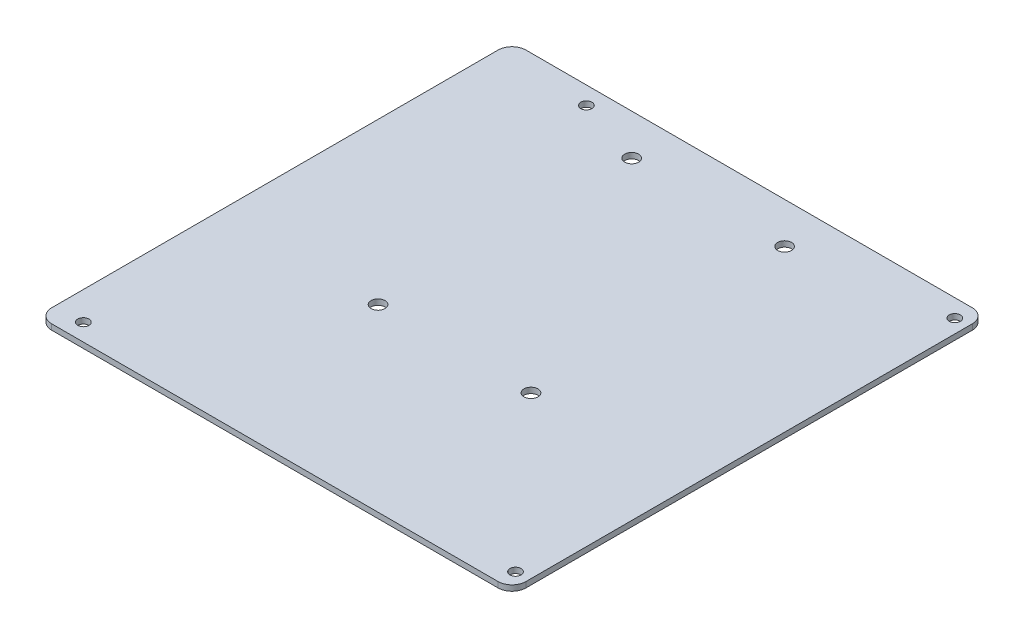
ISO-10303-21;
HEADER;
FILE_DESCRIPTION(('STEP AP214'),'2;1');
FILE_NAME('part.step','',(''),(''),'','','');
FILE_SCHEMA(('AUTOMOTIVE_DESIGN { 1 0 10303 214 1 1 1 1 }'));
ENDSEC;
DATA;
#1=APPLICATION_CONTEXT('core data for automotive mechanical design processes');
#2=APPLICATION_PROTOCOL_DEFINITION('international standard','automotive_design',2000,#1);
#3=PRODUCT_CONTEXT('',#1,'mechanical');
#4=PRODUCT('Part','Part','',(#3));
#5=PRODUCT_RELATED_PRODUCT_CATEGORY('part','',(#4));
#6=PRODUCT_DEFINITION_FORMATION('','',#4);
#7=PRODUCT_DEFINITION_CONTEXT('part definition',#1,'design');
#8=PRODUCT_DEFINITION('design','',#6,#7);
#9=PRODUCT_DEFINITION_SHAPE('','',#8);
#10=(LENGTH_UNIT() NAMED_UNIT(*) SI_UNIT(.MILLI.,.METRE.));
#11=(NAMED_UNIT(*) PLANE_ANGLE_UNIT() SI_UNIT($,.RADIAN.));
#12=(NAMED_UNIT(*) SI_UNIT($,.STERADIAN.) SOLID_ANGLE_UNIT());
#13=UNCERTAINTY_MEASURE_WITH_UNIT(LENGTH_MEASURE(1.E-05),#10,'distance_accuracy_value','');
#14=(GEOMETRIC_REPRESENTATION_CONTEXT(3) GLOBAL_UNCERTAINTY_ASSIGNED_CONTEXT((#13)) GLOBAL_UNIT_ASSIGNED_CONTEXT((#10,
#11,#12)) REPRESENTATION_CONTEXT('',''));
#15=CARTESIAN_POINT('',(0.,0.,0.));
#16=DIRECTION('',(0.,0.,1.));
#17=DIRECTION('',(1.,0.,0.));
#18=AXIS2_PLACEMENT_3D('',#15,#16,#17);
#19=CARTESIAN_POINT('',(80.0000000000019,2.,80.));
#20=DIRECTION('',(0.,-1.,0.));
#21=DIRECTION('',(0.,0.,-1.));
#22=AXIS2_PLACEMENT_3D('',#19,#20,#21);
#23=CYLINDRICAL_SURFACE('',#22,5.);
#24=CARTESIAN_POINT('',(80.0000000000019,0.,80.));
#25=DIRECTION('',(0.,-1.,0.));
#26=DIRECTION('',(0.,0.,-1.));
#27=AXIS2_PLACEMENT_3D('',#24,#25,#26);
#28=CIRCLE('',#27,5.);
#29=CARTESIAN_POINT('',(85.0000000000019,0.,80.));
#30=VERTEX_POINT('',#29);
#31=CARTESIAN_POINT('',(80.0000000000019,0.,85.));
#32=VERTEX_POINT('',#31);
#33=EDGE_CURVE('E134',#30,#32,#28,.T.);
#34=ORIENTED_EDGE('',*,*,#33,.F.);
#35=DIRECTION('',(0.,-1.,0.));
#36=VECTOR('',#35,1.);
#37=CARTESIAN_POINT('',(85.0000000000019,2.,80.));
#38=LINE('',#37,#36);
#39=CARTESIAN_POINT('',(85.0000000000019,2.,80.));
#40=VERTEX_POINT('',#39);
#41=EDGE_CURVE('E11',#40,#30,#38,.T.);
#42=ORIENTED_EDGE('',*,*,#41,.F.);
#43=CARTESIAN_POINT('',(80.0000000000019,2.,80.));
#44=DIRECTION('',(0.,-1.,0.));
#45=DIRECTION('',(0.,0.,-1.));
#46=AXIS2_PLACEMENT_3D('',#43,#44,#45);
#47=CIRCLE('',#46,5.);
#48=CARTESIAN_POINT('',(80.0000000000019,2.,85.));
#49=VERTEX_POINT('',#48);
#50=EDGE_CURVE('E155',#40,#49,#47,.T.);
#51=ORIENTED_EDGE('',*,*,#50,.T.);
#52=DIRECTION('',(0.,-1.,0.));
#53=VECTOR('',#52,1.);
#54=CARTESIAN_POINT('',(80.0000000000019,2.,85.));
#55=LINE('',#54,#53);
#56=EDGE_CURVE('E92',#49,#32,#55,.T.);
#57=ORIENTED_EDGE('',*,*,#56,.T.);
#58=EDGE_LOOP('',(#34,#42,#51,#57));
#59=FACE_BOUND('',#58,.T.);
#60=ADVANCED_FACE('F36',(#59),#23,.T.);
#61=CARTESIAN_POINT('',(85.0000000000019,2.,-80.));
#62=DIRECTION('',(1.,0.,0.));
#63=DIRECTION('',(0.,0.,-1.));
#64=AXIS2_PLACEMENT_3D('',#61,#62,#63);
#65=PLANE('',#64);
#66=DIRECTION('',(0.,0.,1.));
#67=VECTOR('',#66,1.);
#68=CARTESIAN_POINT('',(85.0000000000019,0.,-80.));
#69=LINE('',#68,#67);
#70=CARTESIAN_POINT('',(85.0000000000019,0.,-80.));
#71=VERTEX_POINT('',#70);
#72=EDGE_CURVE('E153',#71,#30,#69,.T.);
#73=ORIENTED_EDGE('',*,*,#72,.F.);
#74=DIRECTION('',(0.,-1.,0.));
#75=VECTOR('',#74,1.);
#76=CARTESIAN_POINT('',(85.0000000000019,2.,-80.));
#77=LINE('',#76,#75);
#78=CARTESIAN_POINT('',(85.0000000000019,2.,-80.));
#79=VERTEX_POINT('',#78);
#80=EDGE_CURVE('E45',#79,#71,#77,.T.);
#81=ORIENTED_EDGE('',*,*,#80,.F.);
#82=DIRECTION('',(0.,0.,1.));
#83=VECTOR('',#82,1.);
#84=CARTESIAN_POINT('',(85.0000000000019,2.,-80.));
#85=LINE('',#84,#83);
#86=EDGE_CURVE('E124',#79,#40,#85,.T.);
#87=ORIENTED_EDGE('',*,*,#86,.T.);
#88=ORIENTED_EDGE('',*,*,#41,.T.);
#89=EDGE_LOOP('',(#73,#81,#87,#88));
#90=FACE_BOUND('',#89,.T.);
#91=ADVANCED_FACE('F224',(#90),#65,.T.);
#92=CARTESIAN_POINT('',(80.0000000000019,2.,-80.));
#93=DIRECTION('',(0.,-1.,0.));
#94=DIRECTION('',(0.,0.,-1.));
#95=AXIS2_PLACEMENT_3D('',#92,#93,#94);
#96=CYLINDRICAL_SURFACE('',#95,5.);
#97=CARTESIAN_POINT('',(80.0000000000019,0.,-80.));
#98=DIRECTION('',(0.,-1.,0.));
#99=DIRECTION('',(0.,0.,-1.));
#100=AXIS2_PLACEMENT_3D('',#97,#98,#99);
#101=CIRCLE('',#100,5.);
#102=CARTESIAN_POINT('',(80.0000000000019,0.,-85.));
#103=VERTEX_POINT('',#102);
#104=EDGE_CURVE('E111',#103,#71,#101,.T.);
#105=ORIENTED_EDGE('',*,*,#104,.F.);
#106=DIRECTION('',(0.,-1.,0.));
#107=VECTOR('',#106,1.);
#108=CARTESIAN_POINT('',(80.0000000000019,2.,-85.));
#109=LINE('',#108,#107);
#110=CARTESIAN_POINT('',(80.0000000000019,2.,-85.));
#111=VERTEX_POINT('',#110);
#112=EDGE_CURVE('E106',#111,#103,#109,.T.);
#113=ORIENTED_EDGE('',*,*,#112,.F.);
#114=CARTESIAN_POINT('',(80.0000000000019,2.,-80.));
#115=DIRECTION('',(0.,-1.,0.));
#116=DIRECTION('',(0.,0.,-1.));
#117=AXIS2_PLACEMENT_3D('',#114,#115,#116);
#118=CIRCLE('',#117,5.);
#119=EDGE_CURVE('E109',#111,#79,#118,.T.);
#120=ORIENTED_EDGE('',*,*,#119,.T.);
#121=ORIENTED_EDGE('',*,*,#80,.T.);
#122=EDGE_LOOP('',(#105,#113,#120,#121));
#123=FACE_BOUND('',#122,.T.);
#124=ADVANCED_FACE('F108',(#123),#96,.T.);
#125=CARTESIAN_POINT('',(-80.,2.,-85.));
#126=DIRECTION('',(0.,0.,-1.));
#127=DIRECTION('',(-1.,0.,0.));
#128=AXIS2_PLACEMENT_3D('',#125,#126,#127);
#129=PLANE('',#128);
#130=DIRECTION('',(1.,0.,0.));
#131=VECTOR('',#130,1.);
#132=CARTESIAN_POINT('',(-80.,0.,-85.));
#133=LINE('',#132,#131);
#134=CARTESIAN_POINT('',(-80.,0.,-85.));
#135=VERTEX_POINT('',#134);
#136=EDGE_CURVE('E150',#135,#103,#133,.T.);
#137=ORIENTED_EDGE('',*,*,#136,.F.);
#138=DIRECTION('',(0.,-1.,0.));
#139=VECTOR('',#138,1.);
#140=CARTESIAN_POINT('',(-80.,2.,-85.));
#141=LINE('',#140,#139);
#142=CARTESIAN_POINT('',(-80.,2.,-85.));
#143=VERTEX_POINT('',#142);
#144=EDGE_CURVE('E116',#143,#135,#141,.T.);
#145=ORIENTED_EDGE('',*,*,#144,.F.);
#146=DIRECTION('',(1.,0.,0.));
#147=VECTOR('',#146,1.);
#148=CARTESIAN_POINT('',(-80.,2.,-85.));
#149=LINE('',#148,#147);
#150=EDGE_CURVE('E122',#143,#111,#149,.T.);
#151=ORIENTED_EDGE('',*,*,#150,.T.);
#152=ORIENTED_EDGE('',*,*,#112,.T.);
#153=EDGE_LOOP('',(#137,#145,#151,#152));
#154=FACE_BOUND('',#153,.T.);
#155=ADVANCED_FACE('F126',(#154),#129,.T.);
#156=CARTESIAN_POINT('',(-80.,2.,-80.));
#157=DIRECTION('',(0.,-1.,0.));
#158=DIRECTION('',(0.,0.,-1.));
#159=AXIS2_PLACEMENT_3D('',#156,#157,#158);
#160=CYLINDRICAL_SURFACE('',#159,4.99999999999999);
#161=CARTESIAN_POINT('',(-80.,0.,-80.));
#162=DIRECTION('',(0.,-1.,0.));
#163=DIRECTION('',(0.,0.,-1.));
#164=AXIS2_PLACEMENT_3D('',#161,#162,#163);
#165=CIRCLE('',#164,4.99999999999999);
#166=CARTESIAN_POINT('',(-85.,0.,-80.));
#167=VERTEX_POINT('',#166);
#168=EDGE_CURVE('E147',#167,#135,#165,.T.);
#169=ORIENTED_EDGE('',*,*,#168,.F.);
#170=DIRECTION('',(0.,-1.,0.));
#171=VECTOR('',#170,1.);
#172=CARTESIAN_POINT('',(-85.,2.,-80.));
#173=LINE('',#172,#171);
#174=CARTESIAN_POINT('',(-85.,2.,-80.));
#175=VERTEX_POINT('',#174);
#176=EDGE_CURVE('E159',#175,#167,#173,.T.);
#177=ORIENTED_EDGE('',*,*,#176,.F.);
#178=CARTESIAN_POINT('',(-80.,2.,-80.));
#179=DIRECTION('',(0.,-1.,0.));
#180=DIRECTION('',(0.,0.,-1.));
#181=AXIS2_PLACEMENT_3D('',#178,#179,#180);
#182=CIRCLE('',#181,4.99999999999999);
#183=EDGE_CURVE('E127',#175,#143,#182,.T.);
#184=ORIENTED_EDGE('',*,*,#183,.T.);
#185=ORIENTED_EDGE('',*,*,#144,.T.);
#186=EDGE_LOOP('',(#169,#177,#184,#185));
#187=FACE_BOUND('',#186,.T.);
#188=ADVANCED_FACE('F237',(#187),#160,.T.);
#189=CARTESIAN_POINT('',(-85.,2.,80.));
#190=DIRECTION('',(-1.,0.,0.));
#191=DIRECTION('',(0.,0.,1.));
#192=AXIS2_PLACEMENT_3D('',#189,#190,#191);
#193=PLANE('',#192);
#194=DIRECTION('',(0.,0.,-1.));
#195=VECTOR('',#194,1.);
#196=CARTESIAN_POINT('',(-85.,0.,80.));
#197=LINE('',#196,#195);
#198=CARTESIAN_POINT('',(-85.,0.,80.));
#199=VERTEX_POINT('',#198);
#200=EDGE_CURVE('E144',#199,#167,#197,.T.);
#201=ORIENTED_EDGE('',*,*,#200,.F.);
#202=DIRECTION('',(0.,-1.,0.));
#203=VECTOR('',#202,1.);
#204=CARTESIAN_POINT('',(-85.,2.,80.));
#205=LINE('',#204,#203);
#206=CARTESIAN_POINT('',(-85.,2.,80.));
#207=VERTEX_POINT('',#206);
#208=EDGE_CURVE('E161',#207,#199,#205,.T.);
#209=ORIENTED_EDGE('',*,*,#208,.F.);
#210=DIRECTION('',(0.,0.,-1.));
#211=VECTOR('',#210,1.);
#212=CARTESIAN_POINT('',(-85.,2.,80.));
#213=LINE('',#212,#211);
#214=EDGE_CURVE('E129',#207,#175,#213,.T.);
#215=ORIENTED_EDGE('',*,*,#214,.T.);
#216=ORIENTED_EDGE('',*,*,#176,.T.);
#217=EDGE_LOOP('',(#201,#209,#215,#216));
#218=FACE_BOUND('',#217,.T.);
#219=ADVANCED_FACE('F215',(#218),#193,.T.);
#220=CARTESIAN_POINT('',(-80.,2.,80.));
#221=DIRECTION('',(0.,-1.,0.));
#222=DIRECTION('',(0.,0.,-1.));
#223=AXIS2_PLACEMENT_3D('',#220,#221,#222);
#224=CYLINDRICAL_SURFACE('',#223,5.00000000000001);
#225=CARTESIAN_POINT('',(-80.,0.,80.));
#226=DIRECTION('',(0.,-1.,0.));
#227=DIRECTION('',(0.,0.,-1.));
#228=AXIS2_PLACEMENT_3D('',#225,#226,#227);
#229=CIRCLE('',#228,5.00000000000001);
#230=CARTESIAN_POINT('',(-80.,0.,85.));
#231=VERTEX_POINT('',#230);
#232=EDGE_CURVE('E141',#231,#199,#229,.T.);
#233=ORIENTED_EDGE('',*,*,#232,.F.);
#234=DIRECTION('',(0.,-1.,0.));
#235=VECTOR('',#234,1.);
#236=CARTESIAN_POINT('',(-80.,2.,85.));
#237=LINE('',#236,#235);
#238=CARTESIAN_POINT('',(-80.,2.,85.));
#239=VERTEX_POINT('',#238);
#240=EDGE_CURVE('E163',#239,#231,#237,.T.);
#241=ORIENTED_EDGE('',*,*,#240,.F.);
#242=CARTESIAN_POINT('',(-80.,2.,80.));
#243=DIRECTION('',(0.,-1.,0.));
#244=DIRECTION('',(0.,0.,-1.));
#245=AXIS2_PLACEMENT_3D('',#242,#243,#244);
#246=CIRCLE('',#245,5.00000000000001);
#247=EDGE_CURVE('E209',#239,#207,#246,.T.);
#248=ORIENTED_EDGE('',*,*,#247,.T.);
#249=ORIENTED_EDGE('',*,*,#208,.T.);
#250=EDGE_LOOP('',(#233,#241,#248,#249));
#251=FACE_BOUND('',#250,.T.);
#252=ADVANCED_FACE('F220',(#251),#224,.T.);
#253=CARTESIAN_POINT('',(80.0000000000019,2.,85.));
#254=DIRECTION('',(0.,0.,1.));
#255=DIRECTION('',(1.,0.,0.));
#256=AXIS2_PLACEMENT_3D('',#253,#254,#255);
#257=PLANE('',#256);
#258=DIRECTION('',(-1.,0.,0.));
#259=VECTOR('',#258,1.);
#260=CARTESIAN_POINT('',(80.0000000000019,0.,85.));
#261=LINE('',#260,#259);
#262=EDGE_CURVE('E137',#32,#231,#261,.T.);
#263=ORIENTED_EDGE('',*,*,#262,.F.);
#264=ORIENTED_EDGE('',*,*,#56,.F.);
#265=DIRECTION('',(-1.,0.,0.));
#266=VECTOR('',#265,1.);
#267=CARTESIAN_POINT('',(80.0000000000019,2.,85.));
#268=LINE('',#267,#266);
#269=EDGE_CURVE('E207',#49,#239,#268,.T.);
#270=ORIENTED_EDGE('',*,*,#269,.T.);
#271=ORIENTED_EDGE('',*,*,#240,.T.);
#272=EDGE_LOOP('',(#263,#264,#270,#271));
#273=FACE_BOUND('',#272,.T.);
#274=ADVANCED_FACE('F221',(#273),#257,.T.);
#275=CARTESIAN_POINT('',(80.0000000000019,2.,80.));
#276=DIRECTION('',(0.,-1.,0.));
#277=DIRECTION('',(0.,0.,-1.));
#278=AXIS2_PLACEMENT_3D('',#275,#276,#277);
#279=PLANE('',#278);
#280=CARTESIAN_POINT('',(-27.4895423311676,2.,-70.3939707006001));
#281=DIRECTION('',(0.,1.,0.));
#282=DIRECTION('',(0.,0.,1.));
#283=AXIS2_PLACEMENT_3D('',#280,#281,#282);
#284=CIRCLE('',#283,2.5);
#285=CARTESIAN_POINT('',(-27.4895423311676,2.,-67.8939707006001));
#286=VERTEX_POINT('',#285);
#287=EDGE_CURVE('E296',#286,#286,#284,.T.);
#288=ORIENTED_EDGE('',*,*,#287,.F.);
#289=EDGE_LOOP('',(#288));
#290=FACE_BOUND('',#289,.T.);
#291=CARTESIAN_POINT('',(27.3344659248238,2.,20.5339375464604));
#292=DIRECTION('',(0.,1.,0.));
#293=DIRECTION('',(0.,0.,1.));
#294=AXIS2_PLACEMENT_3D('',#291,#292,#293);
#295=CIRCLE('',#294,2.5);
#296=CARTESIAN_POINT('',(27.3344659248238,2.,23.0339375464604));
#297=VERTEX_POINT('',#296);
#298=EDGE_CURVE('E293',#297,#297,#295,.T.);
#299=ORIENTED_EDGE('',*,*,#298,.F.);
#300=EDGE_LOOP('',(#299));
#301=FACE_BOUND('',#300,.T.);
#302=CARTESIAN_POINT('',(27.3344659248238,2.,-70.3939707006001));
#303=DIRECTION('',(0.,1.,0.));
#304=DIRECTION('',(0.,0.,1.));
#305=AXIS2_PLACEMENT_3D('',#302,#303,#304);
#306=CIRCLE('',#305,2.5);
#307=CARTESIAN_POINT('',(27.3344659248238,2.,-67.8939707006001));
#308=VERTEX_POINT('',#307);
#309=EDGE_CURVE('E291',#308,#308,#306,.T.);
#310=ORIENTED_EDGE('',*,*,#309,.F.);
#311=EDGE_LOOP('',(#310));
#312=FACE_BOUND('',#311,.T.);
#313=CARTESIAN_POINT('',(-27.4895423311676,2.,20.5339375464604));
#314=DIRECTION('',(0.,1.,0.));
#315=DIRECTION('',(0.,0.,1.));
#316=AXIS2_PLACEMENT_3D('',#313,#314,#315);
#317=CIRCLE('',#316,2.5);
#318=CARTESIAN_POINT('',(-27.4895423311676,2.,23.0339375464604));
#319=VERTEX_POINT('',#318);
#320=EDGE_CURVE('E170',#319,#319,#317,.T.);
#321=ORIENTED_EDGE('',*,*,#320,.F.);
#322=EDGE_LOOP('',(#321));
#323=FACE_BOUND('',#322,.T.);
#324=CARTESIAN_POINT('',(-51.98,2.,-78.65));
#325=DIRECTION('',(0.,-1.,0.));
#326=DIRECTION('',(0.,0.,1.));
#327=AXIS2_PLACEMENT_3D('',#324,#325,#326);
#328=CIRCLE('',#327,2.);
#329=CARTESIAN_POINT('',(-51.98,2.,-76.65));
#330=VERTEX_POINT('',#329);
#331=EDGE_CURVE('E181',#330,#330,#328,.T.);
#332=ORIENTED_EDGE('',*,*,#331,.T.);
#333=EDGE_LOOP('',(#332));
#334=FACE_BOUND('',#333,.T.);
#335=CARTESIAN_POINT('',(80.1,2.,-78.65));
#336=DIRECTION('',(0.,-1.,0.));
#337=DIRECTION('',(0.,0.,1.));
#338=AXIS2_PLACEMENT_3D('',#335,#336,#337);
#339=CIRCLE('',#338,2.);
#340=CARTESIAN_POINT('',(80.1,2.,-76.65));
#341=VERTEX_POINT('',#340);
#342=EDGE_CURVE('E190',#341,#341,#339,.T.);
#343=ORIENTED_EDGE('',*,*,#342,.T.);
#344=EDGE_LOOP('',(#343));
#345=FACE_BOUND('',#344,.T.);
#346=CARTESIAN_POINT('',(80.1,2.,78.83));
#347=DIRECTION('',(0.,-1.,0.));
#348=DIRECTION('',(0.,0.,1.));
#349=AXIS2_PLACEMENT_3D('',#346,#347,#348);
#350=CIRCLE('',#349,2.);
#351=CARTESIAN_POINT('',(80.1,2.,80.83));
#352=VERTEX_POINT('',#351);
#353=EDGE_CURVE('E196',#352,#352,#350,.T.);
#354=ORIENTED_EDGE('',*,*,#353,.T.);
#355=EDGE_LOOP('',(#354));
#356=FACE_BOUND('',#355,.T.);
#357=CARTESIAN_POINT('',(-74.84,2.,78.83));
#358=DIRECTION('',(0.,-1.,0.));
#359=DIRECTION('',(0.,0.,1.));
#360=AXIS2_PLACEMENT_3D('',#357,#358,#359);
#361=CIRCLE('',#360,2.);
#362=CARTESIAN_POINT('',(-74.84,2.,80.83));
#363=VERTEX_POINT('',#362);
#364=EDGE_CURVE('E138',#363,#363,#361,.T.);
#365=ORIENTED_EDGE('',*,*,#364,.T.);
#366=EDGE_LOOP('',(#365));
#367=FACE_BOUND('',#366,.T.);
#368=ORIENTED_EDGE('',*,*,#50,.F.);
#369=ORIENTED_EDGE('',*,*,#86,.F.);
#370=ORIENTED_EDGE('',*,*,#119,.F.);
#371=ORIENTED_EDGE('',*,*,#150,.F.);
#372=ORIENTED_EDGE('',*,*,#183,.F.);
#373=ORIENTED_EDGE('',*,*,#214,.F.);
#374=ORIENTED_EDGE('',*,*,#247,.F.);
#375=ORIENTED_EDGE('',*,*,#269,.F.);
#376=EDGE_LOOP('',(#368,#369,#370,#371,#372,#373,#374,#375));
#377=FACE_BOUND('',#376,.T.);
#378=ADVANCED_FACE('F120',(#290,#301,#312,#323,#334,#345,#356,#367,#377),#279,.F.);
#379=CARTESIAN_POINT('',(80.0000000000019,0.,80.));
#380=DIRECTION('',(0.,-1.,0.));
#381=DIRECTION('',(0.,0.,-1.));
#382=AXIS2_PLACEMENT_3D('',#379,#380,#381);
#383=PLANE('',#382);
#384=CARTESIAN_POINT('',(-27.4895423311676,0.,-70.3939707006001));
#385=DIRECTION('',(0.,-1.,0.));
#386=DIRECTION('',(0.,0.,-1.));
#387=AXIS2_PLACEMENT_3D('',#384,#385,#386);
#388=CIRCLE('',#387,2.5);
#389=CARTESIAN_POINT('',(-27.4895423311676,0.,-72.8939707006001));
#390=VERTEX_POINT('',#389);
#391=EDGE_CURVE('E39',#390,#390,#388,.T.);
#392=ORIENTED_EDGE('',*,*,#391,.F.);
#393=EDGE_LOOP('',(#392));
#394=FACE_BOUND('',#393,.T.);
#395=CARTESIAN_POINT('',(27.3344659248238,0.,20.5339375464604));
#396=DIRECTION('',(0.,-1.,0.));
#397=DIRECTION('',(0.,0.,-1.));
#398=AXIS2_PLACEMENT_3D('',#395,#396,#397);
#399=CIRCLE('',#398,2.5);
#400=CARTESIAN_POINT('',(27.3344659248238,0.,18.0339375464604));
#401=VERTEX_POINT('',#400);
#402=EDGE_CURVE('E172',#401,#401,#399,.T.);
#403=ORIENTED_EDGE('',*,*,#402,.F.);
#404=EDGE_LOOP('',(#403));
#405=FACE_BOUND('',#404,.T.);
#406=CARTESIAN_POINT('',(27.3344659248238,0.,-70.3939707006001));
#407=DIRECTION('',(0.,-1.,0.));
#408=DIRECTION('',(0.,0.,-1.));
#409=AXIS2_PLACEMENT_3D('',#406,#407,#408);
#410=CIRCLE('',#409,2.5);
#411=CARTESIAN_POINT('',(27.3344659248238,0.,-72.8939707006001));
#412=VERTEX_POINT('',#411);
#413=EDGE_CURVE('E169',#412,#412,#410,.T.);
#414=ORIENTED_EDGE('',*,*,#413,.F.);
#415=EDGE_LOOP('',(#414));
#416=FACE_BOUND('',#415,.T.);
#417=CARTESIAN_POINT('',(-27.4895423311676,0.,20.5339375464604));
#418=DIRECTION('',(0.,-1.,0.));
#419=DIRECTION('',(0.,0.,-1.));
#420=AXIS2_PLACEMENT_3D('',#417,#418,#419);
#421=CIRCLE('',#420,2.5);
#422=CARTESIAN_POINT('',(-27.4895423311676,0.,18.0339375464604));
#423=VERTEX_POINT('',#422);
#424=EDGE_CURVE('E166',#423,#423,#421,.T.);
#425=ORIENTED_EDGE('',*,*,#424,.F.);
#426=EDGE_LOOP('',(#425));
#427=FACE_BOUND('',#426,.T.);
#428=CARTESIAN_POINT('',(-51.98,0.,-78.65));
#429=DIRECTION('',(0.,-1.,0.));
#430=DIRECTION('',(0.,0.,1.));
#431=AXIS2_PLACEMENT_3D('',#428,#429,#430);
#432=CIRCLE('',#431,2.);
#433=CARTESIAN_POINT('',(-51.98,0.,-76.65));
#434=VERTEX_POINT('',#433);
#435=EDGE_CURVE('E177',#434,#434,#432,.T.);
#436=ORIENTED_EDGE('',*,*,#435,.F.);
#437=EDGE_LOOP('',(#436));
#438=FACE_BOUND('',#437,.T.);
#439=CARTESIAN_POINT('',(80.1,0.,-78.65));
#440=DIRECTION('',(0.,-1.,0.));
#441=DIRECTION('',(0.,0.,1.));
#442=AXIS2_PLACEMENT_3D('',#439,#440,#441);
#443=CIRCLE('',#442,2.);
#444=CARTESIAN_POINT('',(80.1,0.,-76.65));
#445=VERTEX_POINT('',#444);
#446=EDGE_CURVE('E186',#445,#445,#443,.T.);
#447=ORIENTED_EDGE('',*,*,#446,.F.);
#448=EDGE_LOOP('',(#447));
#449=FACE_BOUND('',#448,.T.);
#450=CARTESIAN_POINT('',(80.1,0.,78.83));
#451=DIRECTION('',(0.,-1.,0.));
#452=DIRECTION('',(0.,0.,1.));
#453=AXIS2_PLACEMENT_3D('',#450,#451,#452);
#454=CIRCLE('',#453,2.);
#455=CARTESIAN_POINT('',(80.1,0.,80.83));
#456=VERTEX_POINT('',#455);
#457=EDGE_CURVE('E193',#456,#456,#454,.T.);
#458=ORIENTED_EDGE('',*,*,#457,.F.);
#459=EDGE_LOOP('',(#458));
#460=FACE_BOUND('',#459,.T.);
#461=CARTESIAN_POINT('',(-74.84,0.,78.83));
#462=DIRECTION('',(0.,-1.,0.));
#463=DIRECTION('',(0.,0.,1.));
#464=AXIS2_PLACEMENT_3D('',#461,#462,#463);
#465=CIRCLE('',#464,2.);
#466=CARTESIAN_POINT('',(-74.84,0.,80.83));
#467=VERTEX_POINT('',#466);
#468=EDGE_CURVE('E199',#467,#467,#465,.T.);
#469=ORIENTED_EDGE('',*,*,#468,.F.);
#470=EDGE_LOOP('',(#469));
#471=FACE_BOUND('',#470,.T.);
#472=ORIENTED_EDGE('',*,*,#33,.T.);
#473=ORIENTED_EDGE('',*,*,#262,.T.);
#474=ORIENTED_EDGE('',*,*,#232,.T.);
#475=ORIENTED_EDGE('',*,*,#200,.T.);
#476=ORIENTED_EDGE('',*,*,#168,.T.);
#477=ORIENTED_EDGE('',*,*,#136,.T.);
#478=ORIENTED_EDGE('',*,*,#104,.T.);
#479=ORIENTED_EDGE('',*,*,#72,.T.);
#480=EDGE_LOOP('',(#472,#473,#474,#475,#476,#477,#478,#479));
#481=FACE_BOUND('',#480,.T.);
#482=ADVANCED_FACE('F223',(#394,#405,#416,#427,#438,#449,#460,#471,#481),#383,.T.);
#483=CARTESIAN_POINT('',(-74.84,2.,78.83));
#484=DIRECTION('',(0.,-1.,0.));
#485=DIRECTION('',(0.,0.,-1.));
#486=AXIS2_PLACEMENT_3D('',#483,#484,#485);
#487=CYLINDRICAL_SURFACE('',#486,2.);
#488=ORIENTED_EDGE('',*,*,#364,.F.);
#489=EDGE_LOOP('',(#488));
#490=FACE_BOUND('',#489,.T.);
#491=ORIENTED_EDGE('',*,*,#468,.T.);
#492=EDGE_LOOP('',(#491));
#493=FACE_BOUND('',#492,.T.);
#494=ADVANCED_FACE('F252',(#490,#493),#487,.F.);
#495=CARTESIAN_POINT('',(80.1,2.,78.83));
#496=DIRECTION('',(0.,-1.,0.));
#497=DIRECTION('',(0.,0.,-1.));
#498=AXIS2_PLACEMENT_3D('',#495,#496,#497);
#499=CYLINDRICAL_SURFACE('',#498,2.);
#500=ORIENTED_EDGE('',*,*,#353,.F.);
#501=EDGE_LOOP('',(#500));
#502=FACE_BOUND('',#501,.T.);
#503=ORIENTED_EDGE('',*,*,#457,.T.);
#504=EDGE_LOOP('',(#503));
#505=FACE_BOUND('',#504,.T.);
#506=ADVANCED_FACE('F259',(#502,#505),#499,.F.);
#507=CARTESIAN_POINT('',(80.1,2.,-78.65));
#508=DIRECTION('',(0.,-1.,0.));
#509=DIRECTION('',(0.,0.,-1.));
#510=AXIS2_PLACEMENT_3D('',#507,#508,#509);
#511=CYLINDRICAL_SURFACE('',#510,2.);
#512=ORIENTED_EDGE('',*,*,#342,.F.);
#513=EDGE_LOOP('',(#512));
#514=FACE_BOUND('',#513,.T.);
#515=ORIENTED_EDGE('',*,*,#446,.T.);
#516=EDGE_LOOP('',(#515));
#517=FACE_BOUND('',#516,.T.);
#518=ADVANCED_FACE('F263',(#514,#517),#511,.F.);
#519=CARTESIAN_POINT('',(-51.98,2.,-78.65));
#520=DIRECTION('',(0.,-1.,0.));
#521=DIRECTION('',(0.,0.,-1.));
#522=AXIS2_PLACEMENT_3D('',#519,#520,#521);
#523=CYLINDRICAL_SURFACE('',#522,2.);
#524=ORIENTED_EDGE('',*,*,#331,.F.);
#525=EDGE_LOOP('',(#524));
#526=FACE_BOUND('',#525,.T.);
#527=ORIENTED_EDGE('',*,*,#435,.T.);
#528=EDGE_LOOP('',(#527));
#529=FACE_BOUND('',#528,.T.);
#530=ADVANCED_FACE('F267',(#526,#529),#523,.F.);
#531=CARTESIAN_POINT('',(-27.4895423311676,-8.,20.5339375464604));
#532=DIRECTION('',(0.,1.,0.));
#533=DIRECTION('',(0.,0.,1.));
#534=AXIS2_PLACEMENT_3D('',#531,#532,#533);
#535=CYLINDRICAL_SURFACE('',#534,2.5);
#536=ORIENTED_EDGE('',*,*,#424,.T.);
#537=EDGE_LOOP('',(#536));
#538=FACE_BOUND('',#537,.T.);
#539=ORIENTED_EDGE('',*,*,#320,.T.);
#540=EDGE_LOOP('',(#539));
#541=FACE_BOUND('',#540,.T.);
#542=ADVANCED_FACE('F271',(#538,#541),#535,.F.);
#543=CARTESIAN_POINT('',(27.3344659248238,-8.,-70.3939707006001));
#544=DIRECTION('',(0.,1.,0.));
#545=DIRECTION('',(0.,0.,1.));
#546=AXIS2_PLACEMENT_3D('',#543,#544,#545);
#547=CYLINDRICAL_SURFACE('',#546,2.5);
#548=ORIENTED_EDGE('',*,*,#413,.T.);
#549=EDGE_LOOP('',(#548));
#550=FACE_BOUND('',#549,.T.);
#551=ORIENTED_EDGE('',*,*,#309,.T.);
#552=EDGE_LOOP('',(#551));
#553=FACE_BOUND('',#552,.T.);
#554=ADVANCED_FACE('F275',(#550,#553),#547,.F.);
#555=CARTESIAN_POINT('',(27.3344659248238,-8.,20.5339375464604));
#556=DIRECTION('',(0.,1.,0.));
#557=DIRECTION('',(0.,0.,1.));
#558=AXIS2_PLACEMENT_3D('',#555,#556,#557);
#559=CYLINDRICAL_SURFACE('',#558,2.5);
#560=ORIENTED_EDGE('',*,*,#402,.T.);
#561=EDGE_LOOP('',(#560));
#562=FACE_BOUND('',#561,.T.);
#563=ORIENTED_EDGE('',*,*,#298,.T.);
#564=EDGE_LOOP('',(#563));
#565=FACE_BOUND('',#564,.T.);
#566=ADVANCED_FACE('F277',(#562,#565),#559,.F.);
#567=CARTESIAN_POINT('',(-27.4895423311676,-8.,-70.3939707006001));
#568=DIRECTION('',(0.,1.,0.));
#569=DIRECTION('',(0.,0.,1.));
#570=AXIS2_PLACEMENT_3D('',#567,#568,#569);
#571=CYLINDRICAL_SURFACE('',#570,2.5);
#572=ORIENTED_EDGE('',*,*,#391,.T.);
#573=EDGE_LOOP('',(#572));
#574=FACE_BOUND('',#573,.T.);
#575=ORIENTED_EDGE('',*,*,#287,.T.);
#576=EDGE_LOOP('',(#575));
#577=FACE_BOUND('',#576,.T.);
#578=ADVANCED_FACE('F280',(#574,#577),#571,.F.);
#579=CLOSED_SHELL('',(#60,#91,#124,#155,#188,#219,#252,#274,#378,#482,#494,#506,#518,#530,#542,
#554,#566,#578));
#580=MANIFOLD_SOLID_BREP('B2',#579);
#581=ADVANCED_BREP_SHAPE_REPRESENTATION('',(#18,#580),#14);
#582=SHAPE_DEFINITION_REPRESENTATION(#9,#581);
ENDSEC;
END-ISO-10303-21;
